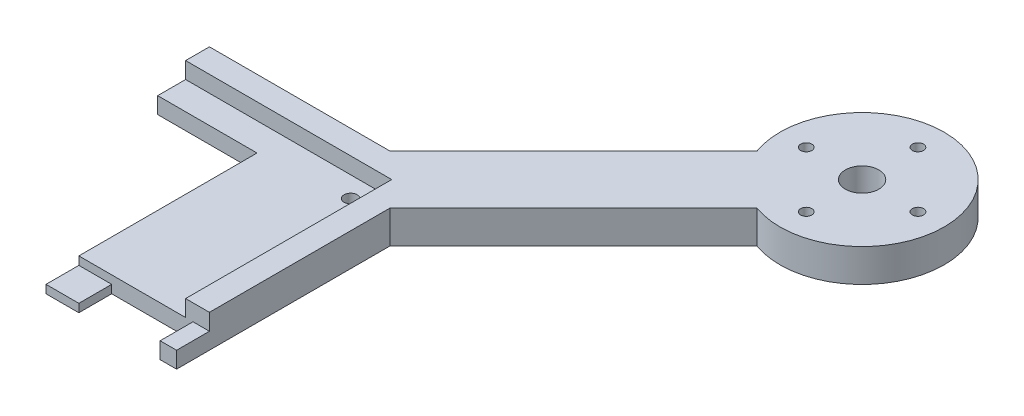
ISO-10303-21;
HEADER;
FILE_DESCRIPTION(('STEP AP214'),'2;1');
FILE_NAME('part.step','',(''),(''),'','','');
FILE_SCHEMA(('AUTOMOTIVE_DESIGN { 1 0 10303 214 1 1 1 1 }'));
ENDSEC;
DATA;
#1=APPLICATION_CONTEXT('core data for automotive mechanical design processes');
#2=APPLICATION_PROTOCOL_DEFINITION('international standard','automotive_design',2000,#1);
#3=PRODUCT_CONTEXT('',#1,'mechanical');
#4=PRODUCT('Part','Part','',(#3));
#5=PRODUCT_RELATED_PRODUCT_CATEGORY('part','',(#4));
#6=PRODUCT_DEFINITION_FORMATION('','',#4);
#7=PRODUCT_DEFINITION_CONTEXT('part definition',#1,'design');
#8=PRODUCT_DEFINITION('design','',#6,#7);
#9=PRODUCT_DEFINITION_SHAPE('','',#8);
#10=(LENGTH_UNIT() NAMED_UNIT(*) SI_UNIT(.MILLI.,.METRE.));
#11=(NAMED_UNIT(*) PLANE_ANGLE_UNIT() SI_UNIT($,.RADIAN.));
#12=(NAMED_UNIT(*) SI_UNIT($,.STERADIAN.) SOLID_ANGLE_UNIT());
#13=UNCERTAINTY_MEASURE_WITH_UNIT(LENGTH_MEASURE(1.E-05),#10,'distance_accuracy_value','');
#14=(GEOMETRIC_REPRESENTATION_CONTEXT(3) GLOBAL_UNCERTAINTY_ASSIGNED_CONTEXT((#13)) GLOBAL_UNIT_ASSIGNED_CONTEXT((#10,
#11,#12)) REPRESENTATION_CONTEXT('',''));
#15=CARTESIAN_POINT('',(0.,0.,0.));
#16=DIRECTION('',(0.,0.,1.));
#17=DIRECTION('',(1.,0.,0.));
#18=AXIS2_PLACEMENT_3D('',#15,#16,#17);
#19=CARTESIAN_POINT('',(-70.,-10.01,0.));
#20=DIRECTION('',(0.,0.,1.));
#21=DIRECTION('',(1.,0.,0.));
#22=AXIS2_PLACEMENT_3D('',#19,#20,#21);
#23=PLANE('',#22);
#24=DIRECTION('',(0.,-1.,0.));
#25=VECTOR('',#24,1.);
#26=CARTESIAN_POINT('',(65.,-10.,0.));
#27=LINE('',#26,#25);
#28=CARTESIAN_POINT('',(65.,-5.,0.));
#29=VERTEX_POINT('',#28);
#30=CARTESIAN_POINT('',(65.,-10.,0.));
#31=VERTEX_POINT('',#30);
#32=EDGE_CURVE('E65',#29,#31,#27,.T.);
#33=ORIENTED_EDGE('',*,*,#32,.F.);
#34=DIRECTION('',(-1.,0.,0.));
#35=VECTOR('',#34,1.);
#36=CARTESIAN_POINT('',(70.,-5.,0.));
#37=LINE('',#36,#35);
#38=CARTESIAN_POINT('',(70.,-5.,0.));
#39=VERTEX_POINT('',#38);
#40=EDGE_CURVE('E231',#39,#29,#37,.T.);
#41=ORIENTED_EDGE('',*,*,#40,.F.);
#42=DIRECTION('',(0.,-1.,0.));
#43=VECTOR('',#42,1.);
#44=CARTESIAN_POINT('',(70.,-10.,0.));
#45=LINE('',#44,#43);
#46=CARTESIAN_POINT('',(70.,0.,0.));
#47=VERTEX_POINT('',#46);
#48=EDGE_CURVE('E394',#47,#39,#45,.T.);
#49=ORIENTED_EDGE('',*,*,#48,.F.);
#50=DIRECTION('',(1.,0.,0.));
#51=VECTOR('',#50,1.);
#52=CARTESIAN_POINT('',(134.350288425444,0.,0.));
#53=LINE('',#52,#51);
#54=CARTESIAN_POINT('',(62.75,0.,0.));
#55=VERTEX_POINT('',#54);
#56=EDGE_CURVE('E390',#55,#47,#53,.T.);
#57=ORIENTED_EDGE('',*,*,#56,.F.);
#58=DIRECTION('',(0.,-1.,0.));
#59=VECTOR('',#58,1.);
#60=CARTESIAN_POINT('',(62.75,-5.,0.));
#61=LINE('',#60,#59);
#62=CARTESIAN_POINT('',(62.75,-5.,0.));
#63=VERTEX_POINT('',#62);
#64=EDGE_CURVE('E403',#55,#63,#61,.T.);
#65=ORIENTED_EDGE('',*,*,#64,.T.);
#66=DIRECTION('',(1.,0.,0.));
#67=VECTOR('',#66,1.);
#68=CARTESIAN_POINT('',(0.,-5.,0.));
#69=LINE('',#68,#67);
#70=CARTESIAN_POINT('',(30.25,-5.,0.));
#71=VERTEX_POINT('',#70);
#72=EDGE_CURVE('E43',#71,#63,#69,.T.);
#73=ORIENTED_EDGE('',*,*,#72,.F.);
#74=DIRECTION('',(0.,-1.,0.));
#75=VECTOR('',#74,1.);
#76=CARTESIAN_POINT('',(30.25,-10.,0.));
#77=LINE('',#76,#75);
#78=CARTESIAN_POINT('',(30.25,-7.5,0.));
#79=VERTEX_POINT('',#78);
#80=EDGE_CURVE('E395',#71,#79,#77,.T.);
#81=ORIENTED_EDGE('',*,*,#80,.T.);
#82=DIRECTION('',(-1.,0.,0.));
#83=VECTOR('',#82,1.);
#84=CARTESIAN_POINT('',(30.25,-7.5,0.));
#85=LINE('',#84,#83);
#86=CARTESIAN_POINT('',(40.25,-7.5,0.));
#87=VERTEX_POINT('',#86);
#88=EDGE_CURVE('E253',#87,#79,#85,.T.);
#89=ORIENTED_EDGE('',*,*,#88,.F.);
#90=DIRECTION('',(0.,1.,0.));
#91=VECTOR('',#90,1.);
#92=CARTESIAN_POINT('',(40.25,-10.,0.));
#93=LINE('',#92,#91);
#94=CARTESIAN_POINT('',(40.25,-10.,0.));
#95=VERTEX_POINT('',#94);
#96=EDGE_CURVE('E247',#95,#87,#93,.T.);
#97=ORIENTED_EDGE('',*,*,#96,.F.);
#98=DIRECTION('',(1.,0.,0.));
#99=VECTOR('',#98,1.);
#100=CARTESIAN_POINT('',(134.350288425444,-10.,0.));
#101=LINE('',#100,#99);
#102=EDGE_CURVE('E400',#95,#31,#101,.T.);
#103=ORIENTED_EDGE('',*,*,#102,.T.);
#104=EDGE_LOOP('',(#33,#41,#49,#57,#65,#73,#81,#89,#97,#103));
#105=FACE_BOUND('',#104,.T.);
#106=ADVANCED_FACE('F39',(#105),#23,.T.);
#107=CARTESIAN_POINT('',(0.,-10.01,-70.));
#108=DIRECTION('',(-1.,0.,0.));
#109=DIRECTION('',(0.,0.,1.));
#110=AXIS2_PLACEMENT_3D('',#107,#108,#109);
#111=PLANE('',#110);
#112=DIRECTION('',(0.,0.,-1.));
#113=VECTOR('',#112,1.);
#114=CARTESIAN_POINT('',(0.,-4.9,-70.));
#115=LINE('',#114,#113);
#116=CARTESIAN_POINT('',(0.,-4.9,-64.9));
#117=VERTEX_POINT('',#116);
#118=CARTESIAN_POINT('',(0.,-4.9,-70.));
#119=VERTEX_POINT('',#118);
#120=EDGE_CURVE('E789',#117,#119,#115,.T.);
#121=ORIENTED_EDGE('',*,*,#120,.F.);
#122=DIRECTION('',(0.,1.,0.));
#123=VECTOR('',#122,1.);
#124=CARTESIAN_POINT('',(0.,-10.,-64.9));
#125=LINE('',#124,#123);
#126=CARTESIAN_POINT('',(0.,-10.,-64.9));
#127=VERTEX_POINT('',#126);
#128=EDGE_CURVE('E791',#127,#117,#125,.T.);
#129=ORIENTED_EDGE('',*,*,#128,.F.);
#130=DIRECTION('',(0.,0.,1.));
#131=VECTOR('',#130,1.);
#132=CARTESIAN_POINT('',(0.,-10.,-134.350288425444));
#133=LINE('',#132,#131);
#134=CARTESIAN_POINT('',(0.,-10.,-54.25));
#135=VERTEX_POINT('',#134);
#136=EDGE_CURVE('E206',#127,#135,#133,.T.);
#137=ORIENTED_EDGE('',*,*,#136,.T.);
#138=DIRECTION('',(0.,1.,0.));
#139=VECTOR('',#138,1.);
#140=CARTESIAN_POINT('',(0.,-10.,-54.25));
#141=LINE('',#140,#139);
#142=CARTESIAN_POINT('',(0.,-5.,-54.25));
#143=VERTEX_POINT('',#142);
#144=EDGE_CURVE('E396',#135,#143,#141,.T.);
#145=ORIENTED_EDGE('',*,*,#144,.T.);
#146=DIRECTION('',(0.,0.,1.));
#147=VECTOR('',#146,1.);
#148=CARTESIAN_POINT('',(0.,-5.,0.));
#149=LINE('',#148,#147);
#150=CARTESIAN_POINT('',(0.,-5.,-62.75));
#151=VERTEX_POINT('',#150);
#152=EDGE_CURVE('E295',#151,#143,#149,.T.);
#153=ORIENTED_EDGE('',*,*,#152,.F.);
#154=DIRECTION('',(0.,1.,0.));
#155=VECTOR('',#154,1.);
#156=CARTESIAN_POINT('',(0.,-5.,-62.75));
#157=LINE('',#156,#155);
#158=CARTESIAN_POINT('',(0.,0.,-62.75));
#159=VERTEX_POINT('',#158);
#160=EDGE_CURVE('E280',#151,#159,#157,.T.);
#161=ORIENTED_EDGE('',*,*,#160,.T.);
#162=DIRECTION('',(0.,0.,1.));
#163=VECTOR('',#162,1.);
#164=CARTESIAN_POINT('',(0.,0.,-134.350288425444));
#165=LINE('',#164,#163);
#166=CARTESIAN_POINT('',(0.,0.,-70.));
#167=VERTEX_POINT('',#166);
#168=EDGE_CURVE('E386',#167,#159,#165,.T.);
#169=ORIENTED_EDGE('',*,*,#168,.F.);
#170=DIRECTION('',(0.,1.,0.));
#171=VECTOR('',#170,1.);
#172=CARTESIAN_POINT('',(0.,-10.,-70.));
#173=LINE('',#172,#171);
#174=EDGE_CURVE('E391',#119,#167,#173,.T.);
#175=ORIENTED_EDGE('',*,*,#174,.F.);
#176=EDGE_LOOP('',(#121,#129,#137,#145,#153,#161,#169,#175));
#177=FACE_BOUND('',#176,.T.);
#178=ADVANCED_FACE('F474',(#177),#111,.T.);
#179=CARTESIAN_POINT('',(-55.,-10.,-70.));
#180=DIRECTION('',(0.,0.,-1.));
#181=DIRECTION('',(-1.,0.,0.));
#182=AXIS2_PLACEMENT_3D('',#179,#180,#181);
#183=PLANE('',#182);
#184=DIRECTION('',(-1.,0.,0.));
#185=VECTOR('',#184,1.);
#186=CARTESIAN_POINT('',(10.1,-4.9,-70.));
#187=LINE('',#186,#185);
#188=CARTESIAN_POINT('',(10.1,-4.9,-70.));
#189=VERTEX_POINT('',#188);
#190=EDGE_CURVE('E211',#189,#119,#187,.T.);
#191=ORIENTED_EDGE('',*,*,#190,.T.);
#192=ORIENTED_EDGE('',*,*,#174,.T.);
#193=DIRECTION('',(-1.,0.,0.));
#194=VECTOR('',#193,1.);
#195=CARTESIAN_POINT('',(-55.,0.,-70.));
#196=LINE('',#195,#194);
#197=CARTESIAN_POINT('',(55.,0.,-70.));
#198=VERTEX_POINT('',#197);
#199=EDGE_CURVE('E327',#198,#167,#196,.T.);
#200=ORIENTED_EDGE('',*,*,#199,.F.);
#201=DIRECTION('',(0.,1.,0.));
#202=VECTOR('',#201,1.);
#203=CARTESIAN_POINT('',(55.,-10.,-70.));
#204=LINE('',#203,#202);
#205=CARTESIAN_POINT('',(55.,-10.,-70.));
#206=VERTEX_POINT('',#205);
#207=EDGE_CURVE('E292',#206,#198,#204,.T.);
#208=ORIENTED_EDGE('',*,*,#207,.F.);
#209=DIRECTION('',(-1.,0.,0.));
#210=VECTOR('',#209,1.);
#211=CARTESIAN_POINT('',(-55.,-10.,-70.));
#212=LINE('',#211,#210);
#213=CARTESIAN_POINT('',(10.1,-10.,-70.));
#214=VERTEX_POINT('',#213);
#215=EDGE_CURVE('E301',#206,#214,#212,.T.);
#216=ORIENTED_EDGE('',*,*,#215,.T.);
#217=DIRECTION('',(0.,-1.,0.));
#218=VECTOR('',#217,1.);
#219=CARTESIAN_POINT('',(10.1,-10.,-70.));
#220=LINE('',#219,#218);
#221=EDGE_CURVE('E57',#189,#214,#220,.T.);
#222=ORIENTED_EDGE('',*,*,#221,.F.);
#223=EDGE_LOOP('',(#191,#192,#200,#208,#216,#222));
#224=FACE_BOUND('',#223,.T.);
#225=ADVANCED_FACE('F467',(#224),#183,.T.);
#226=CARTESIAN_POINT('',(55.,-10.,-70.));
#227=DIRECTION('',(-0.707106781186547,0.,-0.707106781186548));
#228=DIRECTION('',(-0.707106781186548,0.,0.707106781186547));
#229=AXIS2_PLACEMENT_3D('',#226,#227,#228);
#230=PLANE('',#229);
#231=DIRECTION('',(-0.707106781186548,0.,0.707106781186547));
#232=VECTOR('',#231,1.);
#233=CARTESIAN_POINT('',(55.,0.,-70.));
#234=LINE('',#233,#232);
#235=CARTESIAN_POINT('',(110.842477831862,0.,-125.842477831862));
#236=VERTEX_POINT('',#235);
#237=EDGE_CURVE('E296',#236,#198,#234,.T.);
#238=ORIENTED_EDGE('',*,*,#237,.F.);
#239=DIRECTION('',(0.,1.,0.));
#240=VECTOR('',#239,1.);
#241=CARTESIAN_POINT('',(110.842477831862,-10.,-125.842477831862));
#242=LINE('',#241,#240);
#243=CARTESIAN_POINT('',(110.842477831862,-10.,-125.842477831862));
#244=VERTEX_POINT('',#243);
#245=EDGE_CURVE('E289',#244,#236,#242,.T.);
#246=ORIENTED_EDGE('',*,*,#245,.F.);
#247=DIRECTION('',(-0.707106781186548,0.,0.707106781186547));
#248=VECTOR('',#247,1.);
#249=CARTESIAN_POINT('',(55.,-10.,-70.));
#250=LINE('',#249,#248);
#251=EDGE_CURVE('E285',#244,#206,#250,.T.);
#252=ORIENTED_EDGE('',*,*,#251,.T.);
#253=ORIENTED_EDGE('',*,*,#207,.T.);
#254=EDGE_LOOP('',(#238,#246,#252,#253));
#255=FACE_BOUND('',#254,.T.);
#256=ADVANCED_FACE('F462',(#255),#230,.T.);
#257=CARTESIAN_POINT('',(134.350288425444,-10.,-134.350288425444));
#258=DIRECTION('',(0.,1.,0.));
#259=DIRECTION('',(0.,0.,1.));
#260=AXIS2_PLACEMENT_3D('',#257,#258,#259);
#261=CYLINDRICAL_SURFACE('',#260,25.);
#262=CARTESIAN_POINT('',(134.350288425444,0.,-134.350288425444));
#263=DIRECTION('',(0.,1.,0.));
#264=DIRECTION('',(0.,0.,1.));
#265=AXIS2_PLACEMENT_3D('',#262,#263,#264);
#266=CIRCLE('',#265,25.);
#267=CARTESIAN_POINT('',(125.842477831862,0.,-110.842477831862));
#268=VERTEX_POINT('',#267);
#269=EDGE_CURVE('E300',#268,#236,#266,.T.);
#270=ORIENTED_EDGE('',*,*,#269,.F.);
#271=DIRECTION('',(0.,1.,0.));
#272=VECTOR('',#271,1.);
#273=CARTESIAN_POINT('',(125.842477831862,-10.,-110.842477831862));
#274=LINE('',#273,#272);
#275=CARTESIAN_POINT('',(125.842477831862,-10.,-110.842477831862));
#276=VERTEX_POINT('',#275);
#277=EDGE_CURVE('E286',#276,#268,#274,.T.);
#278=ORIENTED_EDGE('',*,*,#277,.F.);
#279=CARTESIAN_POINT('',(134.350288425444,-10.,-134.350288425444));
#280=DIRECTION('',(0.,1.,0.));
#281=DIRECTION('',(0.,0.,1.));
#282=AXIS2_PLACEMENT_3D('',#279,#280,#281);
#283=CIRCLE('',#282,25.);
#284=EDGE_CURVE('E313',#276,#244,#283,.T.);
#285=ORIENTED_EDGE('',*,*,#284,.T.);
#286=ORIENTED_EDGE('',*,*,#245,.T.);
#287=EDGE_LOOP('',(#270,#278,#285,#286));
#288=FACE_BOUND('',#287,.T.);
#289=ADVANCED_FACE('F533',(#288),#261,.T.);
#290=CARTESIAN_POINT('',(70.,-10.,-55.));
#291=DIRECTION('',(0.707106781186548,0.,0.707106781186547));
#292=DIRECTION('',(0.707106781186547,0.,-0.707106781186548));
#293=AXIS2_PLACEMENT_3D('',#290,#291,#292);
#294=PLANE('',#293);
#295=DIRECTION('',(0.707106781186547,0.,-0.707106781186548));
#296=VECTOR('',#295,1.);
#297=CARTESIAN_POINT('',(70.,0.,-55.));
#298=LINE('',#297,#296);
#299=CARTESIAN_POINT('',(70.,0.,-55.));
#300=VERTEX_POINT('',#299);
#301=EDGE_CURVE('E305',#300,#268,#298,.T.);
#302=ORIENTED_EDGE('',*,*,#301,.F.);
#303=DIRECTION('',(0.,1.,0.));
#304=VECTOR('',#303,1.);
#305=CARTESIAN_POINT('',(70.,-10.,-55.));
#306=LINE('',#305,#304);
#307=CARTESIAN_POINT('',(70.,-10.,-55.));
#308=VERTEX_POINT('',#307);
#309=EDGE_CURVE('E281',#308,#300,#306,.T.);
#310=ORIENTED_EDGE('',*,*,#309,.F.);
#311=DIRECTION('',(0.707106781186547,0.,-0.707106781186548));
#312=VECTOR('',#311,1.);
#313=CARTESIAN_POINT('',(70.,-10.,-55.));
#314=LINE('',#313,#312);
#315=EDGE_CURVE('E317',#308,#276,#314,.T.);
#316=ORIENTED_EDGE('',*,*,#315,.T.);
#317=ORIENTED_EDGE('',*,*,#277,.T.);
#318=EDGE_LOOP('',(#302,#310,#316,#317));
#319=FACE_BOUND('',#318,.T.);
#320=ADVANCED_FACE('F457',(#319),#294,.T.);
#321=CARTESIAN_POINT('',(70.,-10.,-55.));
#322=DIRECTION('',(1.,0.,0.));
#323=DIRECTION('',(0.,0.,-1.));
#324=AXIS2_PLACEMENT_3D('',#321,#322,#323);
#325=PLANE('',#324);
#326=DIRECTION('',(0.,0.,-1.));
#327=VECTOR('',#326,1.);
#328=CARTESIAN_POINT('',(70.,0.,-55.));
#329=LINE('',#328,#327);
#330=EDGE_CURVE('E309',#47,#300,#329,.T.);
#331=ORIENTED_EDGE('',*,*,#330,.F.);
#332=ORIENTED_EDGE('',*,*,#48,.T.);
#333=DIRECTION('',(0.,0.,-1.));
#334=VECTOR('',#333,1.);
#335=CARTESIAN_POINT('',(70.,-5.,10.));
#336=LINE('',#335,#334);
#337=CARTESIAN_POINT('',(70.,-5.,10.));
#338=VERTEX_POINT('',#337);
#339=EDGE_CURVE('E243',#338,#39,#336,.T.);
#340=ORIENTED_EDGE('',*,*,#339,.F.);
#341=DIRECTION('',(0.,1.,0.));
#342=VECTOR('',#341,1.);
#343=CARTESIAN_POINT('',(70.,-10.,10.));
#344=LINE('',#343,#342);
#345=CARTESIAN_POINT('',(70.,-10.,10.));
#346=VERTEX_POINT('',#345);
#347=EDGE_CURVE('E216',#346,#338,#344,.T.);
#348=ORIENTED_EDGE('',*,*,#347,.F.);
#349=DIRECTION('',(0.,0.,-1.));
#350=VECTOR('',#349,1.);
#351=CARTESIAN_POINT('',(70.,-10.,-55.));
#352=LINE('',#351,#350);
#353=EDGE_CURVE('E321',#346,#308,#352,.T.);
#354=ORIENTED_EDGE('',*,*,#353,.T.);
#355=ORIENTED_EDGE('',*,*,#309,.T.);
#356=EDGE_LOOP('',(#331,#332,#340,#348,#354,#355));
#357=FACE_BOUND('',#356,.T.);
#358=ADVANCED_FACE('F451',(#357),#325,.T.);
#359=CARTESIAN_POINT('',(134.350288425444,-10.,-134.350288425444));
#360=DIRECTION('',(0.,1.,0.));
#361=DIRECTION('',(0.,0.,1.));
#362=AXIS2_PLACEMENT_3D('',#359,#360,#361);
#363=CYLINDRICAL_SURFACE('',#362,5.10000000000027);
#364=CARTESIAN_POINT('',(134.350288425444,-10.,-134.350288425444));
#365=DIRECTION('',(0.,1.,0.));
#366=DIRECTION('',(0.,0.,1.));
#367=AXIS2_PLACEMENT_3D('',#364,#365,#366);
#368=CIRCLE('',#367,5.10000000000027);
#369=CARTESIAN_POINT('',(134.350288425444,-10.,-129.250288425444));
#370=VERTEX_POINT('',#369);
#371=EDGE_CURVE('E362',#370,#370,#368,.T.);
#372=ORIENTED_EDGE('',*,*,#371,.F.);
#373=EDGE_LOOP('',(#372));
#374=FACE_BOUND('',#373,.T.);
#375=CARTESIAN_POINT('',(134.350288425444,0.,-134.350288425444));
#376=DIRECTION('',(0.,1.,0.));
#377=DIRECTION('',(0.,0.,1.));
#378=AXIS2_PLACEMENT_3D('',#375,#376,#377);
#379=CIRCLE('',#378,5.10000000000027);
#380=CARTESIAN_POINT('',(134.350288425444,0.,-129.250288425444));
#381=VERTEX_POINT('',#380);
#382=EDGE_CURVE('E366',#381,#381,#379,.T.);
#383=ORIENTED_EDGE('',*,*,#382,.T.);
#384=EDGE_LOOP('',(#383));
#385=FACE_BOUND('',#384,.T.);
#386=ADVANCED_FACE('F537',(#374,#385),#363,.F.);
#387=CARTESIAN_POINT('',(134.350288425444,-10.,-151.350288425444));
#388=DIRECTION('',(0.,1.,0.));
#389=DIRECTION('',(0.,0.,1.));
#390=AXIS2_PLACEMENT_3D('',#387,#388,#389);
#391=CYLINDRICAL_SURFACE('',#390,1.70000000000001);
#392=CARTESIAN_POINT('',(134.350288425444,-10.,-151.350288425444));
#393=DIRECTION('',(0.,1.,0.));
#394=DIRECTION('',(0.,0.,1.));
#395=AXIS2_PLACEMENT_3D('',#392,#393,#394);
#396=CIRCLE('',#395,1.70000000000001);
#397=CARTESIAN_POINT('',(134.350288425444,-10.,-149.650288425444));
#398=VERTEX_POINT('',#397);
#399=EDGE_CURVE('E354',#398,#398,#396,.T.);
#400=ORIENTED_EDGE('',*,*,#399,.F.);
#401=EDGE_LOOP('',(#400));
#402=FACE_BOUND('',#401,.T.);
#403=CARTESIAN_POINT('',(134.350288425444,0.,-151.350288425444));
#404=DIRECTION('',(0.,1.,0.));
#405=DIRECTION('',(0.,0.,1.));
#406=AXIS2_PLACEMENT_3D('',#403,#404,#405);
#407=CIRCLE('',#406,1.70000000000001);
#408=CARTESIAN_POINT('',(134.350288425444,0.,-149.650288425444));
#409=VERTEX_POINT('',#408);
#410=EDGE_CURVE('E358',#409,#409,#407,.T.);
#411=ORIENTED_EDGE('',*,*,#410,.T.);
#412=EDGE_LOOP('',(#411));
#413=FACE_BOUND('',#412,.T.);
#414=ADVANCED_FACE('F557',(#402,#413),#391,.F.);
#415=CARTESIAN_POINT('',(151.350288425444,-10.,-134.350288425444));
#416=DIRECTION('',(0.,1.,0.));
#417=DIRECTION('',(0.,0.,1.));
#418=AXIS2_PLACEMENT_3D('',#415,#416,#417);
#419=CYLINDRICAL_SURFACE('',#418,1.70000000000001);
#420=CARTESIAN_POINT('',(151.350288425444,-10.,-134.350288425444));
#421=DIRECTION('',(0.,1.,0.));
#422=DIRECTION('',(0.,0.,1.));
#423=AXIS2_PLACEMENT_3D('',#420,#421,#422);
#424=CIRCLE('',#423,1.70000000000001);
#425=CARTESIAN_POINT('',(151.350288425444,-10.,-132.650288425444));
#426=VERTEX_POINT('',#425);
#427=EDGE_CURVE('E346',#426,#426,#424,.T.);
#428=ORIENTED_EDGE('',*,*,#427,.F.);
#429=EDGE_LOOP('',(#428));
#430=FACE_BOUND('',#429,.T.);
#431=CARTESIAN_POINT('',(151.350288425444,0.,-134.350288425444));
#432=DIRECTION('',(0.,1.,0.));
#433=DIRECTION('',(0.,0.,1.));
#434=AXIS2_PLACEMENT_3D('',#431,#432,#433);
#435=CIRCLE('',#434,1.70000000000001);
#436=CARTESIAN_POINT('',(151.350288425444,0.,-132.650288425444));
#437=VERTEX_POINT('',#436);
#438=EDGE_CURVE('E350',#437,#437,#435,.T.);
#439=ORIENTED_EDGE('',*,*,#438,.T.);
#440=EDGE_LOOP('',(#439));
#441=FACE_BOUND('',#440,.T.);
#442=ADVANCED_FACE('F574',(#430,#441),#419,.F.);
#443=CARTESIAN_POINT('',(117.350288425444,-10.,-134.350288425444));
#444=DIRECTION('',(0.,1.,0.));
#445=DIRECTION('',(0.,0.,1.));
#446=AXIS2_PLACEMENT_3D('',#443,#444,#445);
#447=CYLINDRICAL_SURFACE('',#446,1.7);
#448=CARTESIAN_POINT('',(117.350288425444,-10.,-134.350288425444));
#449=DIRECTION('',(0.,1.,0.));
#450=DIRECTION('',(0.,0.,1.));
#451=AXIS2_PLACEMENT_3D('',#448,#449,#450);
#452=CIRCLE('',#451,1.7);
#453=CARTESIAN_POINT('',(117.350288425444,-10.,-132.650288425444));
#454=VERTEX_POINT('',#453);
#455=EDGE_CURVE('E338',#454,#454,#452,.T.);
#456=ORIENTED_EDGE('',*,*,#455,.F.);
#457=EDGE_LOOP('',(#456));
#458=FACE_BOUND('',#457,.T.);
#459=CARTESIAN_POINT('',(117.350288425444,0.,-134.350288425444));
#460=DIRECTION('',(0.,1.,0.));
#461=DIRECTION('',(0.,0.,1.));
#462=AXIS2_PLACEMENT_3D('',#459,#460,#461);
#463=CIRCLE('',#462,1.7);
#464=CARTESIAN_POINT('',(117.350288425444,0.,-132.650288425444));
#465=VERTEX_POINT('',#464);
#466=EDGE_CURVE('E342',#465,#465,#463,.T.);
#467=ORIENTED_EDGE('',*,*,#466,.T.);
#468=EDGE_LOOP('',(#467));
#469=FACE_BOUND('',#468,.T.);
#470=ADVANCED_FACE('F570',(#458,#469),#447,.F.);
#471=CARTESIAN_POINT('',(134.350288425444,-10.,-117.350288425444));
#472=DIRECTION('',(0.,1.,0.));
#473=DIRECTION('',(0.,0.,1.));
#474=AXIS2_PLACEMENT_3D('',#471,#472,#473);
#475=CYLINDRICAL_SURFACE('',#474,1.70000000000001);
#476=CARTESIAN_POINT('',(134.350288425444,-10.,-117.350288425444));
#477=DIRECTION('',(0.,1.,0.));
#478=DIRECTION('',(0.,0.,1.));
#479=AXIS2_PLACEMENT_3D('',#476,#477,#478);
#480=CIRCLE('',#479,1.70000000000001);
#481=CARTESIAN_POINT('',(134.350288425444,-10.,-115.650288425444));
#482=VERTEX_POINT('',#481);
#483=EDGE_CURVE('E332',#482,#482,#480,.T.);
#484=ORIENTED_EDGE('',*,*,#483,.F.);
#485=EDGE_LOOP('',(#484));
#486=FACE_BOUND('',#485,.T.);
#487=CARTESIAN_POINT('',(134.350288425444,0.,-117.350288425444));
#488=DIRECTION('',(0.,1.,0.));
#489=DIRECTION('',(0.,0.,1.));
#490=AXIS2_PLACEMENT_3D('',#487,#488,#489);
#491=CIRCLE('',#490,1.70000000000001);
#492=CARTESIAN_POINT('',(134.350288425444,0.,-115.650288425444));
#493=VERTEX_POINT('',#492);
#494=EDGE_CURVE('E334',#493,#493,#491,.T.);
#495=ORIENTED_EDGE('',*,*,#494,.T.);
#496=EDGE_LOOP('',(#495));
#497=FACE_BOUND('',#496,.T.);
#498=ADVANCED_FACE('F540',(#486,#497),#475,.F.);
#499=CARTESIAN_POINT('',(-30.25,-10.,-54.25));
#500=DIRECTION('',(0.,0.,-1.));
#501=DIRECTION('',(-1.,0.,0.));
#502=AXIS2_PLACEMENT_3D('',#499,#500,#501);
#503=PLANE('',#502);
#504=ORIENTED_EDGE('',*,*,#144,.F.);
#505=DIRECTION('',(-1.,0.,0.));
#506=VECTOR('',#505,1.);
#507=CARTESIAN_POINT('',(-30.25,-10.,-54.25));
#508=LINE('',#507,#506);
#509=CARTESIAN_POINT('',(30.25,-10.,-54.25));
#510=VERTEX_POINT('',#509);
#511=EDGE_CURVE('E326',#510,#135,#508,.T.);
#512=ORIENTED_EDGE('',*,*,#511,.F.);
#513=DIRECTION('',(0.,1.,0.));
#514=VECTOR('',#513,1.);
#515=CARTESIAN_POINT('',(30.25,-10.,-54.25));
#516=LINE('',#515,#514);
#517=CARTESIAN_POINT('',(30.25,-5.,-54.25));
#518=VERTEX_POINT('',#517);
#519=EDGE_CURVE('E322',#510,#518,#516,.T.);
#520=ORIENTED_EDGE('',*,*,#519,.T.);
#521=DIRECTION('',(1.,0.,0.));
#522=VECTOR('',#521,1.);
#523=CARTESIAN_POINT('',(-30.25,-5.,-54.25));
#524=LINE('',#523,#522);
#525=EDGE_CURVE('E379',#143,#518,#524,.T.);
#526=ORIENTED_EDGE('',*,*,#525,.F.);
#527=EDGE_LOOP('',(#504,#512,#520,#526));
#528=FACE_BOUND('',#527,.T.);
#529=ADVANCED_FACE('F494',(#528),#503,.F.);
#530=CARTESIAN_POINT('',(30.25,-10.,-54.25));
#531=DIRECTION('',(1.,0.,0.));
#532=DIRECTION('',(0.,0.,-1.));
#533=AXIS2_PLACEMENT_3D('',#530,#531,#532);
#534=PLANE('',#533);
#535=ORIENTED_EDGE('',*,*,#80,.F.);
#536=DIRECTION('',(0.,0.,1.));
#537=VECTOR('',#536,1.);
#538=CARTESIAN_POINT('',(30.25,-5.,-54.25));
#539=LINE('',#538,#537);
#540=EDGE_CURVE('E370',#518,#71,#539,.T.);
#541=ORIENTED_EDGE('',*,*,#540,.F.);
#542=ORIENTED_EDGE('',*,*,#519,.F.);
#543=DIRECTION('',(0.,0.,-1.));
#544=VECTOR('',#543,1.);
#545=CARTESIAN_POINT('',(30.25,-10.,-54.25));
#546=LINE('',#545,#544);
#547=CARTESIAN_POINT('',(30.25,-10.,10.));
#548=VERTEX_POINT('',#547);
#549=EDGE_CURVE('E333',#548,#510,#546,.T.);
#550=ORIENTED_EDGE('',*,*,#549,.F.);
#551=DIRECTION('',(0.,-1.,0.));
#552=VECTOR('',#551,1.);
#553=CARTESIAN_POINT('',(30.25,-10.,10.));
#554=LINE('',#553,#552);
#555=CARTESIAN_POINT('',(30.25,-7.5,10.));
#556=VERTEX_POINT('',#555);
#557=EDGE_CURVE('E248',#556,#548,#554,.T.);
#558=ORIENTED_EDGE('',*,*,#557,.F.);
#559=DIRECTION('',(0.,0.,-1.));
#560=VECTOR('',#559,1.);
#561=CARTESIAN_POINT('',(30.25,-7.5,10.));
#562=LINE('',#561,#560);
#563=EDGE_CURVE('E262',#556,#79,#562,.T.);
#564=ORIENTED_EDGE('',*,*,#563,.T.);
#565=EDGE_LOOP('',(#535,#541,#542,#550,#558,#564));
#566=FACE_BOUND('',#565,.T.);
#567=ADVANCED_FACE('F486',(#566),#534,.F.);
#568=CARTESIAN_POINT('',(56.4999999999999,-10.,-56.4999999999999));
#569=DIRECTION('',(0.,1.,0.));
#570=DIRECTION('',(0.,0.,1.));
#571=AXIS2_PLACEMENT_3D('',#568,#569,#570);
#572=CYLINDRICAL_SURFACE('',#571,2.00000000000042);
#573=CARTESIAN_POINT('',(56.4999999999999,-10.,-56.4999999999999));
#574=DIRECTION('',(0.,1.,0.));
#575=DIRECTION('',(0.,0.,1.));
#576=AXIS2_PLACEMENT_3D('',#573,#574,#575);
#577=CIRCLE('',#576,2.00000000000042);
#578=CARTESIAN_POINT('',(56.4999999999999,-10.,-54.4999999999995));
#579=VERTEX_POINT('',#578);
#580=EDGE_CURVE('E328',#579,#579,#577,.T.);
#581=ORIENTED_EDGE('',*,*,#580,.F.);
#582=EDGE_LOOP('',(#581));
#583=FACE_BOUND('',#582,.T.);
#584=CARTESIAN_POINT('',(56.4999999999999,-5.,-56.4999999999999));
#585=DIRECTION('',(0.,1.,0.));
#586=DIRECTION('',(0.,0.,1.));
#587=AXIS2_PLACEMENT_3D('',#584,#585,#586);
#588=CIRCLE('',#587,2.00000000000042);
#589=CARTESIAN_POINT('',(56.4999999999999,-5.,-54.4999999999995));
#590=VERTEX_POINT('',#589);
#591=EDGE_CURVE('E374',#590,#590,#588,.F.);
#592=ORIENTED_EDGE('',*,*,#591,.F.);
#593=EDGE_LOOP('',(#592));
#594=FACE_BOUND('',#593,.T.);
#595=ADVANCED_FACE('F553',(#583,#594),#572,.F.);
#596=CARTESIAN_POINT('',(134.350288425444,0.,-134.350288425444));
#597=DIRECTION('',(0.,1.,0.));
#598=DIRECTION('',(0.,0.,1.));
#599=AXIS2_PLACEMENT_3D('',#596,#597,#598);
#600=PLANE('',#599);
#601=ORIENTED_EDGE('',*,*,#494,.F.);
#602=EDGE_LOOP('',(#601));
#603=FACE_BOUND('',#602,.T.);
#604=ORIENTED_EDGE('',*,*,#466,.F.);
#605=EDGE_LOOP('',(#604));
#606=FACE_BOUND('',#605,.T.);
#607=ORIENTED_EDGE('',*,*,#438,.F.);
#608=EDGE_LOOP('',(#607));
#609=FACE_BOUND('',#608,.T.);
#610=ORIENTED_EDGE('',*,*,#410,.F.);
#611=EDGE_LOOP('',(#610));
#612=FACE_BOUND('',#611,.T.);
#613=ORIENTED_EDGE('',*,*,#382,.F.);
#614=EDGE_LOOP('',(#613));
#615=FACE_BOUND('',#614,.T.);
#616=DIRECTION('',(0.,0.,-1.));
#617=VECTOR('',#616,1.);
#618=CARTESIAN_POINT('',(62.75,0.,-62.75));
#619=LINE('',#618,#617);
#620=CARTESIAN_POINT('',(62.75,0.,-62.75));
#621=VERTEX_POINT('',#620);
#622=EDGE_CURVE('E11',#55,#621,#619,.T.);
#623=ORIENTED_EDGE('',*,*,#622,.F.);
#624=ORIENTED_EDGE('',*,*,#56,.T.);
#625=ORIENTED_EDGE('',*,*,#330,.T.);
#626=ORIENTED_EDGE('',*,*,#301,.T.);
#627=ORIENTED_EDGE('',*,*,#269,.T.);
#628=ORIENTED_EDGE('',*,*,#237,.T.);
#629=ORIENTED_EDGE('',*,*,#199,.T.);
#630=ORIENTED_EDGE('',*,*,#168,.T.);
#631=DIRECTION('',(-1.,0.,0.));
#632=VECTOR('',#631,1.);
#633=CARTESIAN_POINT('',(-62.75,0.,-62.75));
#634=LINE('',#633,#632);
#635=EDGE_CURVE('E49',#621,#159,#634,.T.);
#636=ORIENTED_EDGE('',*,*,#635,.F.);
#637=EDGE_LOOP('',(#623,#624,#625,#626,#627,#628,#629,#630,#636));
#638=FACE_BOUND('',#637,.T.);
#639=ADVANCED_FACE('F445',(#603,#606,#609,#612,#615,#638),#600,.T.);
#640=CARTESIAN_POINT('',(62.75,-5.,-62.75));
#641=DIRECTION('',(1.,0.,0.));
#642=DIRECTION('',(0.,0.,-1.));
#643=AXIS2_PLACEMENT_3D('',#640,#641,#642);
#644=PLANE('',#643);
#645=ORIENTED_EDGE('',*,*,#64,.F.);
#646=ORIENTED_EDGE('',*,*,#622,.T.);
#647=DIRECTION('',(0.,1.,0.));
#648=VECTOR('',#647,1.);
#649=CARTESIAN_POINT('',(62.75,-5.,-62.75));
#650=LINE('',#649,#648);
#651=CARTESIAN_POINT('',(62.75,-5.,-62.75));
#652=VERTEX_POINT('',#651);
#653=EDGE_CURVE('E378',#652,#621,#650,.T.);
#654=ORIENTED_EDGE('',*,*,#653,.F.);
#655=DIRECTION('',(0.,0.,-1.));
#656=VECTOR('',#655,1.);
#657=CARTESIAN_POINT('',(62.75,-5.,-62.75));
#658=LINE('',#657,#656);
#659=EDGE_CURVE('E418',#63,#652,#658,.T.);
#660=ORIENTED_EDGE('',*,*,#659,.F.);
#661=EDGE_LOOP('',(#645,#646,#654,#660));
#662=FACE_BOUND('',#661,.T.);
#663=ADVANCED_FACE('F41',(#662),#644,.F.);
#664=CARTESIAN_POINT('',(0.,-5.,0.));
#665=DIRECTION('',(0.,1.,0.));
#666=DIRECTION('',(0.,0.,1.));
#667=AXIS2_PLACEMENT_3D('',#664,#665,#666);
#668=PLANE('',#667);
#669=ORIENTED_EDGE('',*,*,#591,.T.);
#670=EDGE_LOOP('',(#669));
#671=FACE_BOUND('',#670,.T.);
#672=ORIENTED_EDGE('',*,*,#540,.T.);
#673=ORIENTED_EDGE('',*,*,#72,.T.);
#674=ORIENTED_EDGE('',*,*,#659,.T.);
#675=DIRECTION('',(-1.,0.,0.));
#676=VECTOR('',#675,1.);
#677=CARTESIAN_POINT('',(-62.75,-5.,-62.75));
#678=LINE('',#677,#676);
#679=EDGE_CURVE('E383',#652,#151,#678,.T.);
#680=ORIENTED_EDGE('',*,*,#679,.T.);
#681=ORIENTED_EDGE('',*,*,#152,.T.);
#682=ORIENTED_EDGE('',*,*,#525,.T.);
#683=EDGE_LOOP('',(#672,#673,#674,#680,#681,#682));
#684=FACE_BOUND('',#683,.T.);
#685=ADVANCED_FACE('F490',(#671,#684),#668,.T.);
#686=CARTESIAN_POINT('',(-62.75,-5.,-62.75));
#687=DIRECTION('',(0.,0.,-1.));
#688=DIRECTION('',(-1.,0.,0.));
#689=AXIS2_PLACEMENT_3D('',#686,#687,#688);
#690=PLANE('',#689);
#691=ORIENTED_EDGE('',*,*,#160,.F.);
#692=ORIENTED_EDGE('',*,*,#679,.F.);
#693=ORIENTED_EDGE('',*,*,#653,.T.);
#694=ORIENTED_EDGE('',*,*,#635,.T.);
#695=EDGE_LOOP('',(#691,#692,#693,#694));
#696=FACE_BOUND('',#695,.T.);
#697=ADVANCED_FACE('F477',(#696),#690,.F.);
#698=CARTESIAN_POINT('',(134.350288425444,-10.,-134.350288425444));
#699=DIRECTION('',(0.,1.,0.));
#700=DIRECTION('',(0.,0.,1.));
#701=AXIS2_PLACEMENT_3D('',#698,#699,#700);
#702=PLANE('',#701);
#703=ORIENTED_EDGE('',*,*,#580,.T.);
#704=EDGE_LOOP('',(#703));
#705=FACE_BOUND('',#704,.T.);
#706=ORIENTED_EDGE('',*,*,#483,.T.);
#707=EDGE_LOOP('',(#706));
#708=FACE_BOUND('',#707,.T.);
#709=ORIENTED_EDGE('',*,*,#455,.T.);
#710=EDGE_LOOP('',(#709));
#711=FACE_BOUND('',#710,.T.);
#712=ORIENTED_EDGE('',*,*,#427,.T.);
#713=EDGE_LOOP('',(#712));
#714=FACE_BOUND('',#713,.T.);
#715=ORIENTED_EDGE('',*,*,#399,.T.);
#716=EDGE_LOOP('',(#715));
#717=FACE_BOUND('',#716,.T.);
#718=ORIENTED_EDGE('',*,*,#371,.T.);
#719=EDGE_LOOP('',(#718));
#720=FACE_BOUND('',#719,.T.);
#721=ORIENTED_EDGE('',*,*,#136,.F.);
#722=DIRECTION('',(-1.,0.,0.));
#723=VECTOR('',#722,1.);
#724=CARTESIAN_POINT('',(10.1,-10.,-64.9));
#725=LINE('',#724,#723);
#726=CARTESIAN_POINT('',(10.1,-10.,-64.9));
#727=VERTEX_POINT('',#726);
#728=EDGE_CURVE('E189',#727,#127,#725,.T.);
#729=ORIENTED_EDGE('',*,*,#728,.F.);
#730=DIRECTION('',(0.,0.,1.));
#731=VECTOR('',#730,1.);
#732=CARTESIAN_POINT('',(10.1,-10.,-70.));
#733=LINE('',#732,#731);
#734=EDGE_CURVE('E195',#214,#727,#733,.T.);
#735=ORIENTED_EDGE('',*,*,#734,.F.);
#736=ORIENTED_EDGE('',*,*,#215,.F.);
#737=ORIENTED_EDGE('',*,*,#251,.F.);
#738=ORIENTED_EDGE('',*,*,#284,.F.);
#739=ORIENTED_EDGE('',*,*,#315,.F.);
#740=ORIENTED_EDGE('',*,*,#353,.F.);
#741=DIRECTION('',(1.,0.,0.));
#742=VECTOR('',#741,1.);
#743=CARTESIAN_POINT('',(70.,-10.,10.));
#744=LINE('',#743,#742);
#745=CARTESIAN_POINT('',(65.,-10.,10.));
#746=VERTEX_POINT('',#745);
#747=EDGE_CURVE('E226',#746,#346,#744,.T.);
#748=ORIENTED_EDGE('',*,*,#747,.F.);
#749=DIRECTION('',(0.,0.,-1.));
#750=VECTOR('',#749,1.);
#751=CARTESIAN_POINT('',(65.,-10.,10.));
#752=LINE('',#751,#750);
#753=EDGE_CURVE('E230',#746,#31,#752,.T.);
#754=ORIENTED_EDGE('',*,*,#753,.T.);
#755=ORIENTED_EDGE('',*,*,#102,.F.);
#756=DIRECTION('',(0.,0.,-1.));
#757=VECTOR('',#756,1.);
#758=CARTESIAN_POINT('',(40.25,-10.,10.));
#759=LINE('',#758,#757);
#760=CARTESIAN_POINT('',(40.25,-10.,10.));
#761=VERTEX_POINT('',#760);
#762=EDGE_CURVE('E276',#761,#95,#759,.T.);
#763=ORIENTED_EDGE('',*,*,#762,.F.);
#764=DIRECTION('',(1.,0.,0.));
#765=VECTOR('',#764,1.);
#766=CARTESIAN_POINT('',(30.25,-10.,10.));
#767=LINE('',#766,#765);
#768=EDGE_CURVE('E252',#548,#761,#767,.T.);
#769=ORIENTED_EDGE('',*,*,#768,.F.);
#770=ORIENTED_EDGE('',*,*,#549,.T.);
#771=ORIENTED_EDGE('',*,*,#511,.T.);
#772=EDGE_LOOP('',(#721,#729,#735,#736,#737,#738,#739,#740,#748,#754,#755,#763,#769,#770,#771));
#773=FACE_BOUND('',#772,.T.);
#774=ADVANCED_FACE('F204',(#705,#708,#711,#714,#717,#720,#773),#702,.F.);
#775=CARTESIAN_POINT('',(40.25,-10.,10.));
#776=DIRECTION('',(-1.,0.,0.));
#777=DIRECTION('',(0.,0.,1.));
#778=AXIS2_PLACEMENT_3D('',#775,#776,#777);
#779=PLANE('',#778);
#780=ORIENTED_EDGE('',*,*,#96,.T.);
#781=DIRECTION('',(0.,0.,-1.));
#782=VECTOR('',#781,1.);
#783=CARTESIAN_POINT('',(40.25,-7.5,10.));
#784=LINE('',#783,#782);
#785=CARTESIAN_POINT('',(40.25,-7.5,10.));
#786=VERTEX_POINT('',#785);
#787=EDGE_CURVE('E272',#786,#87,#784,.T.);
#788=ORIENTED_EDGE('',*,*,#787,.F.);
#789=DIRECTION('',(0.,1.,0.));
#790=VECTOR('',#789,1.);
#791=CARTESIAN_POINT('',(40.25,-10.,10.));
#792=LINE('',#791,#790);
#793=EDGE_CURVE('E256',#761,#786,#792,.T.);
#794=ORIENTED_EDGE('',*,*,#793,.F.);
#795=ORIENTED_EDGE('',*,*,#762,.T.);
#796=EDGE_LOOP('',(#780,#788,#794,#795));
#797=FACE_BOUND('',#796,.T.);
#798=ADVANCED_FACE('F507',(#797),#779,.F.);
#799=CARTESIAN_POINT('',(30.25,-7.5,10.));
#800=DIRECTION('',(0.,-1.,0.));
#801=DIRECTION('',(0.,0.,-1.));
#802=AXIS2_PLACEMENT_3D('',#799,#800,#801);
#803=PLANE('',#802);
#804=ORIENTED_EDGE('',*,*,#88,.T.);
#805=ORIENTED_EDGE('',*,*,#563,.F.);
#806=DIRECTION('',(-1.,0.,0.));
#807=VECTOR('',#806,1.);
#808=CARTESIAN_POINT('',(30.25,-7.5,10.));
#809=LINE('',#808,#807);
#810=EDGE_CURVE('E259',#786,#556,#809,.T.);
#811=ORIENTED_EDGE('',*,*,#810,.F.);
#812=ORIENTED_EDGE('',*,*,#787,.T.);
#813=EDGE_LOOP('',(#804,#805,#811,#812));
#814=FACE_BOUND('',#813,.T.);
#815=ADVANCED_FACE('F505',(#814),#803,.F.);
#816=CARTESIAN_POINT('',(0.,0.,10.));
#817=DIRECTION('',(0.,0.,-1.));
#818=DIRECTION('',(-1.,0.,0.));
#819=AXIS2_PLACEMENT_3D('',#816,#817,#818);
#820=PLANE('',#819);
#821=ORIENTED_EDGE('',*,*,#557,.T.);
#822=ORIENTED_EDGE('',*,*,#768,.T.);
#823=ORIENTED_EDGE('',*,*,#793,.T.);
#824=ORIENTED_EDGE('',*,*,#810,.T.);
#825=EDGE_LOOP('',(#821,#822,#823,#824));
#826=FACE_BOUND('',#825,.T.);
#827=ADVANCED_FACE('F501',(#826),#820,.F.);
#828=CARTESIAN_POINT('',(70.,-5.,10.));
#829=DIRECTION('',(0.,-1.,0.));
#830=DIRECTION('',(1.,0.,0.));
#831=AXIS2_PLACEMENT_3D('',#828,#829,#830);
#832=PLANE('',#831);
#833=ORIENTED_EDGE('',*,*,#40,.T.);
#834=DIRECTION('',(0.,0.,-1.));
#835=VECTOR('',#834,1.);
#836=CARTESIAN_POINT('',(65.,-5.,10.));
#837=LINE('',#836,#835);
#838=CARTESIAN_POINT('',(65.,-5.,10.));
#839=VERTEX_POINT('',#838);
#840=EDGE_CURVE('E239',#839,#29,#837,.T.);
#841=ORIENTED_EDGE('',*,*,#840,.F.);
#842=DIRECTION('',(-1.,0.,0.));
#843=VECTOR('',#842,1.);
#844=CARTESIAN_POINT('',(70.,-5.,10.));
#845=LINE('',#844,#843);
#846=EDGE_CURVE('E220',#338,#839,#845,.T.);
#847=ORIENTED_EDGE('',*,*,#846,.F.);
#848=ORIENTED_EDGE('',*,*,#339,.T.);
#849=EDGE_LOOP('',(#833,#841,#847,#848));
#850=FACE_BOUND('',#849,.T.);
#851=ADVANCED_FACE('F664',(#850),#832,.F.);
#852=CARTESIAN_POINT('',(65.,-10.,10.));
#853=DIRECTION('',(1.,0.,0.));
#854=DIRECTION('',(0.,0.,-1.));
#855=AXIS2_PLACEMENT_3D('',#852,#853,#854);
#856=PLANE('',#855);
#857=ORIENTED_EDGE('',*,*,#32,.T.);
#858=ORIENTED_EDGE('',*,*,#753,.F.);
#859=DIRECTION('',(0.,-1.,0.));
#860=VECTOR('',#859,1.);
#861=CARTESIAN_POINT('',(65.,-10.,10.));
#862=LINE('',#861,#860);
#863=EDGE_CURVE('E223',#839,#746,#862,.T.);
#864=ORIENTED_EDGE('',*,*,#863,.F.);
#865=ORIENTED_EDGE('',*,*,#840,.T.);
#866=EDGE_LOOP('',(#857,#858,#864,#865));
#867=FACE_BOUND('',#866,.T.);
#868=ADVANCED_FACE('F673',(#867),#856,.F.);
#869=CARTESIAN_POINT('',(0.,0.,10.));
#870=DIRECTION('',(0.,0.,1.));
#871=DIRECTION('',(1.,0.,0.));
#872=AXIS2_PLACEMENT_3D('',#869,#870,#871);
#873=PLANE('',#872);
#874=ORIENTED_EDGE('',*,*,#347,.T.);
#875=ORIENTED_EDGE('',*,*,#846,.T.);
#876=ORIENTED_EDGE('',*,*,#863,.T.);
#877=ORIENTED_EDGE('',*,*,#747,.T.);
#878=EDGE_LOOP('',(#874,#875,#876,#877));
#879=FACE_BOUND('',#878,.T.);
#880=ADVANCED_FACE('F683',(#879),#873,.T.);
#881=CARTESIAN_POINT('',(10.1,-4.9,-70.));
#882=DIRECTION('',(0.,1.,0.));
#883=DIRECTION('',(0.,0.,1.));
#884=AXIS2_PLACEMENT_3D('',#881,#882,#883);
#885=PLANE('',#884);
#886=ORIENTED_EDGE('',*,*,#120,.T.);
#887=ORIENTED_EDGE('',*,*,#190,.F.);
#888=DIRECTION('',(0.,0.,-1.));
#889=VECTOR('',#888,1.);
#890=CARTESIAN_POINT('',(10.1,-4.9,-70.));
#891=LINE('',#890,#889);
#892=CARTESIAN_POINT('',(10.1,-4.9,-64.9));
#893=VERTEX_POINT('',#892);
#894=EDGE_CURVE('E194',#893,#189,#891,.T.);
#895=ORIENTED_EDGE('',*,*,#894,.F.);
#896=DIRECTION('',(-1.,0.,0.));
#897=VECTOR('',#896,1.);
#898=CARTESIAN_POINT('',(10.1,-4.9,-64.9));
#899=LINE('',#898,#897);
#900=EDGE_CURVE('E191',#893,#117,#899,.T.);
#901=ORIENTED_EDGE('',*,*,#900,.T.);
#902=EDGE_LOOP('',(#886,#887,#895,#901));
#903=FACE_BOUND('',#902,.T.);
#904=ADVANCED_FACE('F692',(#903),#885,.F.);
#905=CARTESIAN_POINT('',(10.1,-10.,-64.9));
#906=DIRECTION('',(0.,0.,1.));
#907=DIRECTION('',(1.,0.,0.));
#908=AXIS2_PLACEMENT_3D('',#905,#906,#907);
#909=PLANE('',#908);
#910=ORIENTED_EDGE('',*,*,#128,.T.);
#911=ORIENTED_EDGE('',*,*,#900,.F.);
#912=DIRECTION('',(0.,1.,0.));
#913=VECTOR('',#912,1.);
#914=CARTESIAN_POINT('',(10.1,-10.,-64.9));
#915=LINE('',#914,#913);
#916=EDGE_CURVE('E185',#727,#893,#915,.T.);
#917=ORIENTED_EDGE('',*,*,#916,.F.);
#918=ORIENTED_EDGE('',*,*,#728,.T.);
#919=EDGE_LOOP('',(#910,#911,#917,#918));
#920=FACE_BOUND('',#919,.T.);
#921=ADVANCED_FACE('F187',(#920),#909,.F.);
#922=CARTESIAN_POINT('',(10.1,0.,0.));
#923=DIRECTION('',(1.,0.,0.));
#924=DIRECTION('',(0.,0.,-1.));
#925=AXIS2_PLACEMENT_3D('',#922,#923,#924);
#926=PLANE('',#925);
#927=ORIENTED_EDGE('',*,*,#221,.T.);
#928=ORIENTED_EDGE('',*,*,#734,.T.);
#929=ORIENTED_EDGE('',*,*,#916,.T.);
#930=ORIENTED_EDGE('',*,*,#894,.T.);
#931=EDGE_LOOP('',(#927,#928,#929,#930));
#932=FACE_BOUND('',#931,.T.);
#933=ADVANCED_FACE('F197',(#932),#926,.F.);
#934=CLOSED_SHELL('',(#106,#178,#225,#256,#289,#320,#358,#386,#414,#442,#470,#498,#529,#567,
#595,#639,#663,#685,#697,#774,#798,#815,#827,#851,#868,#880,#904,#921,#933));
#935=MANIFOLD_SOLID_BREP('B2',#934);
#936=ADVANCED_BREP_SHAPE_REPRESENTATION('',(#18,#935),#14);
#937=SHAPE_DEFINITION_REPRESENTATION(#9,#936);
ENDSEC;
END-ISO-10303-21;
